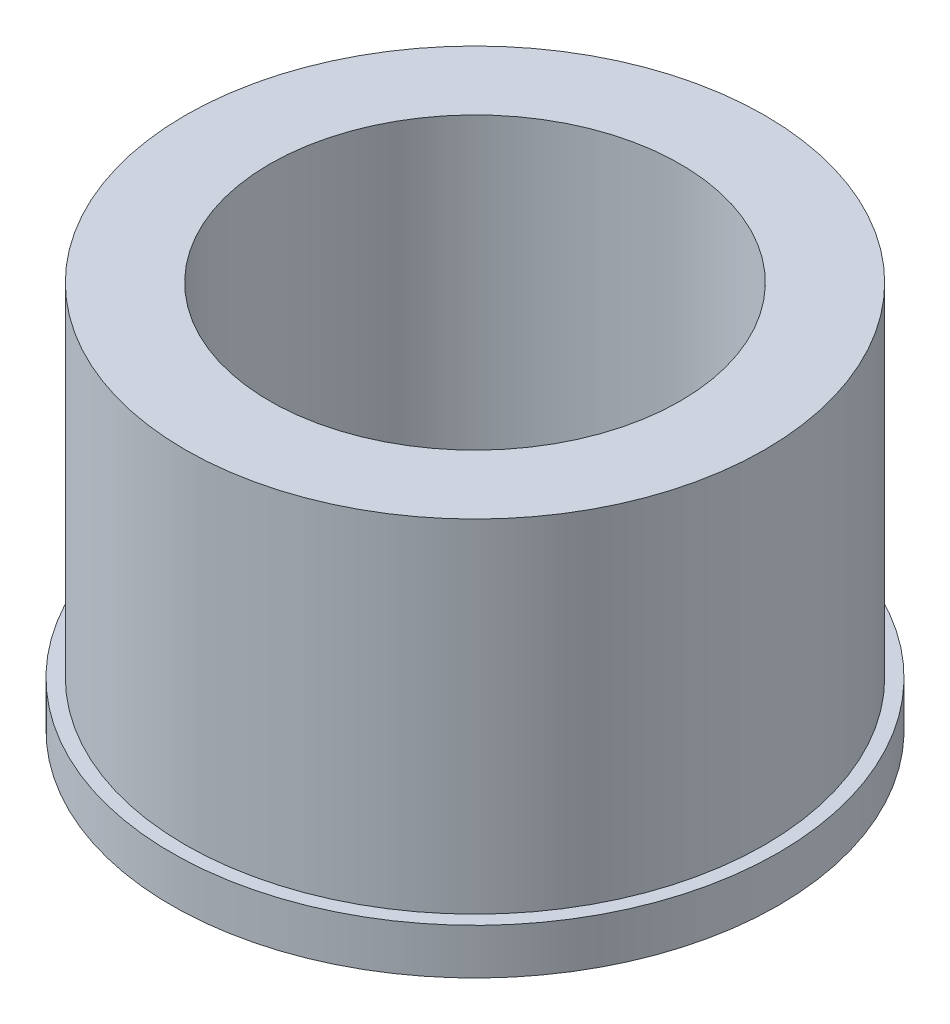
ISO-10303-21;
HEADER;
FILE_DESCRIPTION(('STEP AP214'),'2;1');
FILE_NAME('part.step','',(''),(''),'','','');
FILE_SCHEMA(('AUTOMOTIVE_DESIGN { 1 0 10303 214 1 1 1 1 }'));
ENDSEC;
DATA;
#1=APPLICATION_CONTEXT('core data for automotive mechanical design processes');
#2=APPLICATION_PROTOCOL_DEFINITION('international standard','automotive_design',2000,#1);
#3=PRODUCT_CONTEXT('',#1,'mechanical');
#4=PRODUCT('Part','Part','',(#3));
#5=PRODUCT_RELATED_PRODUCT_CATEGORY('part','',(#4));
#6=PRODUCT_DEFINITION_FORMATION('','',#4);
#7=PRODUCT_DEFINITION_CONTEXT('part definition',#1,'design');
#8=PRODUCT_DEFINITION('design','',#6,#7);
#9=PRODUCT_DEFINITION_SHAPE('','',#8);
#10=(LENGTH_UNIT() NAMED_UNIT(*) SI_UNIT(.MILLI.,.METRE.));
#11=(NAMED_UNIT(*) PLANE_ANGLE_UNIT() SI_UNIT($,.RADIAN.));
#12=(NAMED_UNIT(*) SI_UNIT($,.STERADIAN.) SOLID_ANGLE_UNIT());
#13=UNCERTAINTY_MEASURE_WITH_UNIT(LENGTH_MEASURE(1.E-05),#10,'distance_accuracy_value','');
#14=(GEOMETRIC_REPRESENTATION_CONTEXT(3) GLOBAL_UNCERTAINTY_ASSIGNED_CONTEXT((#13)) GLOBAL_UNIT_ASSIGNED_CONTEXT((#10,
#11,#12)) REPRESENTATION_CONTEXT('',''));
#15=CARTESIAN_POINT('',(0.,0.,0.));
#16=DIRECTION('',(0.,0.,1.));
#17=DIRECTION('',(1.,0.,0.));
#18=AXIS2_PLACEMENT_3D('',#15,#16,#17);
#19=CARTESIAN_POINT('',(0.,0.,0.));
#20=DIRECTION('',(0.,-1.,0.));
#21=DIRECTION('',(-1.,0.,0.));
#22=AXIS2_PLACEMENT_3D('',#19,#20,#21);
#23=PLANE('',#22);
#24=CARTESIAN_POINT('',(0.,0.,0.));
#25=DIRECTION('',(0.,1.,0.));
#26=DIRECTION('',(1.,0.,0.));
#27=AXIS2_PLACEMENT_3D('',#24,#25,#26);
#28=CIRCLE('',#27,6.65);
#29=CARTESIAN_POINT('',(6.65,0.,0.));
#30=VERTEX_POINT('',#29);
#31=EDGE_CURVE('E23',#30,#30,#28,.T.);
#32=ORIENTED_EDGE('',*,*,#31,.F.);
#33=EDGE_LOOP('',(#32));
#34=FACE_BOUND('',#33,.T.);
#35=CARTESIAN_POINT('',(0.,0.,0.));
#36=DIRECTION('',(0.,-1.,0.));
#37=DIRECTION('',(1.,0.,0.));
#38=AXIS2_PLACEMENT_3D('',#35,#36,#37);
#39=CIRCLE('',#38,4.5);
#40=CARTESIAN_POINT('',(4.5,0.,0.));
#41=VERTEX_POINT('',#40);
#42=EDGE_CURVE('E32',#41,#41,#39,.T.);
#43=ORIENTED_EDGE('',*,*,#42,.F.);
#44=EDGE_LOOP('',(#43));
#45=FACE_BOUND('',#44,.T.);
#46=ADVANCED_FACE('F15',(#34,#45),#23,.T.);
#47=CARTESIAN_POINT('',(0.,8.925,0.));
#48=DIRECTION('',(0.,-1.,0.));
#49=DIRECTION('',(-1.,0.,0.));
#50=AXIS2_PLACEMENT_3D('',#47,#48,#49);
#51=CYLINDRICAL_SURFACE('',#50,6.65);
#52=CARTESIAN_POINT('',(0.,1.,0.));
#53=DIRECTION('',(0.,-1.,0.));
#54=DIRECTION('',(1.,0.,0.));
#55=AXIS2_PLACEMENT_3D('',#52,#53,#54);
#56=CIRCLE('',#55,6.65);
#57=CARTESIAN_POINT('',(6.65,1.,0.));
#58=VERTEX_POINT('',#57);
#59=EDGE_CURVE('E10',#58,#58,#56,.T.);
#60=ORIENTED_EDGE('',*,*,#59,.T.);
#61=EDGE_LOOP('',(#60));
#62=FACE_BOUND('',#61,.T.);
#63=ORIENTED_EDGE('',*,*,#31,.T.);
#64=EDGE_LOOP('',(#63));
#65=FACE_BOUND('',#64,.T.);
#66=ADVANCED_FACE('F52',(#62,#65),#51,.T.);
#67=CARTESIAN_POINT('',(0.,1.,0.));
#68=DIRECTION('',(0.,-1.,0.));
#69=DIRECTION('',(-1.,0.,0.));
#70=AXIS2_PLACEMENT_3D('',#67,#68,#69);
#71=PLANE('',#70);
#72=ORIENTED_EDGE('',*,*,#59,.F.);
#73=EDGE_LOOP('',(#72));
#74=FACE_BOUND('',#73,.T.);
#75=CARTESIAN_POINT('',(0.,1.,0.));
#76=DIRECTION('',(0.,1.,0.));
#77=DIRECTION('',(1.,0.,0.));
#78=AXIS2_PLACEMENT_3D('',#75,#76,#77);
#79=CIRCLE('',#78,6.35);
#80=CARTESIAN_POINT('',(6.35,1.,0.));
#81=VERTEX_POINT('',#80);
#82=EDGE_CURVE('E33',#81,#81,#79,.T.);
#83=ORIENTED_EDGE('',*,*,#82,.F.);
#84=EDGE_LOOP('',(#83));
#85=FACE_BOUND('',#84,.T.);
#86=ADVANCED_FACE('F59',(#74,#85),#71,.F.);
#87=CARTESIAN_POINT('',(0.,8.925,0.));
#88=DIRECTION('',(0.,-1.,0.));
#89=DIRECTION('',(-1.,0.,0.));
#90=AXIS2_PLACEMENT_3D('',#87,#88,#89);
#91=CYLINDRICAL_SURFACE('',#90,6.35);
#92=CARTESIAN_POINT('',(0.,8.5,0.));
#93=DIRECTION('',(0.,-1.,0.));
#94=DIRECTION('',(1.,0.,0.));
#95=AXIS2_PLACEMENT_3D('',#92,#93,#94);
#96=CIRCLE('',#95,6.35);
#97=CARTESIAN_POINT('',(6.35000000000001,8.5,0.));
#98=VERTEX_POINT('',#97);
#99=EDGE_CURVE('E28',#98,#98,#96,.T.);
#100=ORIENTED_EDGE('',*,*,#99,.T.);
#101=EDGE_LOOP('',(#100));
#102=FACE_BOUND('',#101,.T.);
#103=ORIENTED_EDGE('',*,*,#82,.T.);
#104=EDGE_LOOP('',(#103));
#105=FACE_BOUND('',#104,.T.);
#106=ADVANCED_FACE('F38',(#102,#105),#91,.T.);
#107=CARTESIAN_POINT('',(0.,8.5,0.));
#108=DIRECTION('',(0.,-1.,0.));
#109=DIRECTION('',(-1.,0.,0.));
#110=AXIS2_PLACEMENT_3D('',#107,#108,#109);
#111=PLANE('',#110);
#112=ORIENTED_EDGE('',*,*,#99,.F.);
#113=EDGE_LOOP('',(#112));
#114=FACE_BOUND('',#113,.T.);
#115=CARTESIAN_POINT('',(0.,8.5,0.));
#116=DIRECTION('',(0.,1.,0.));
#117=DIRECTION('',(1.,0.,0.));
#118=AXIS2_PLACEMENT_3D('',#115,#116,#117);
#119=CIRCLE('',#118,4.5);
#120=CARTESIAN_POINT('',(4.50000000000001,8.5,0.));
#121=VERTEX_POINT('',#120);
#122=EDGE_CURVE('E19',#121,#121,#119,.T.);
#123=ORIENTED_EDGE('',*,*,#122,.F.);
#124=EDGE_LOOP('',(#123));
#125=FACE_BOUND('',#124,.T.);
#126=ADVANCED_FACE('F41',(#114,#125),#111,.F.);
#127=CARTESIAN_POINT('',(0.,8.925,0.));
#128=DIRECTION('',(0.,-1.,0.));
#129=DIRECTION('',(-1.,0.,0.));
#130=AXIS2_PLACEMENT_3D('',#127,#128,#129);
#131=CYLINDRICAL_SURFACE('',#130,4.5);
#132=ORIENTED_EDGE('',*,*,#42,.T.);
#133=EDGE_LOOP('',(#132));
#134=FACE_BOUND('',#133,.T.);
#135=ORIENTED_EDGE('',*,*,#122,.T.);
#136=EDGE_LOOP('',(#135));
#137=FACE_BOUND('',#136,.T.);
#138=ADVANCED_FACE('F17',(#134,#137),#131,.F.);
#139=CLOSED_SHELL('',(#46,#66,#86,#106,#126,#138));
#140=MANIFOLD_SOLID_BREP('B1',#139);
#141=ADVANCED_BREP_SHAPE_REPRESENTATION('',(#18,#140),#14);
#142=SHAPE_DEFINITION_REPRESENTATION(#9,#141);
ENDSEC;
END-ISO-10303-21;
